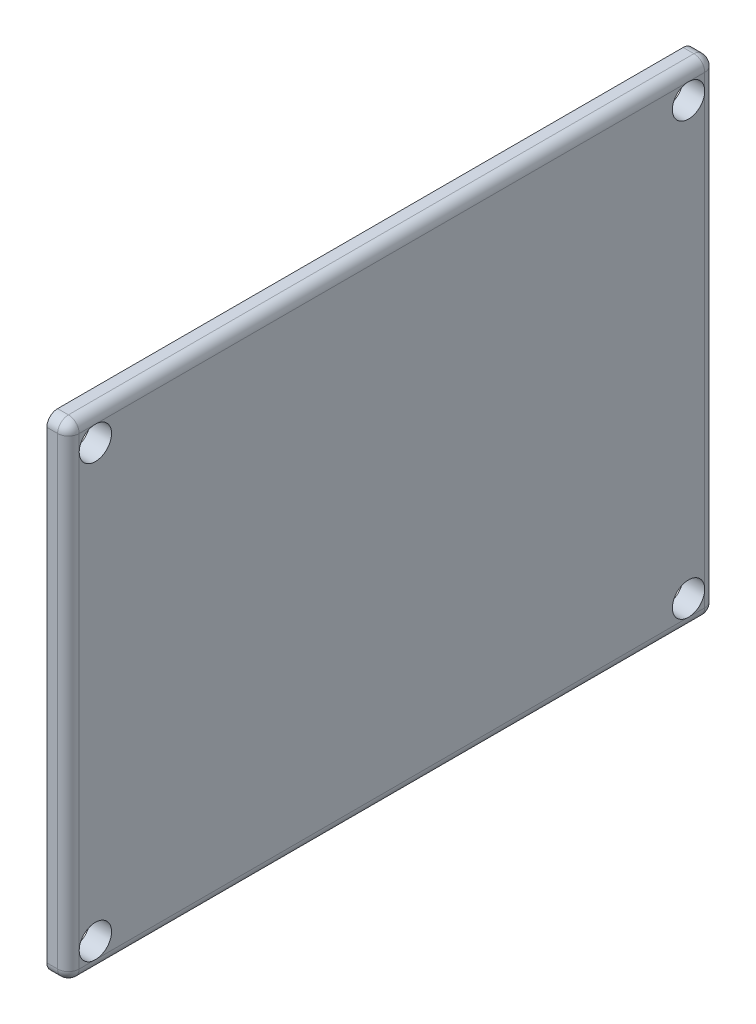
ISO-10303-21;
HEADER;
FILE_DESCRIPTION(('STEP AP214'),'2;1');
FILE_NAME('part.step','',(''),(''),'','','');
FILE_SCHEMA(('AUTOMOTIVE_DESIGN { 1 0 10303 214 1 1 1 1 }'));
ENDSEC;
DATA;
#1=APPLICATION_CONTEXT('core data for automotive mechanical design processes');
#2=APPLICATION_PROTOCOL_DEFINITION('international standard','automotive_design',2000,#1);
#3=PRODUCT_CONTEXT('',#1,'mechanical');
#4=PRODUCT('Part','Part','',(#3));
#5=PRODUCT_RELATED_PRODUCT_CATEGORY('part','',(#4));
#6=PRODUCT_DEFINITION_FORMATION('','',#4);
#7=PRODUCT_DEFINITION_CONTEXT('part definition',#1,'design');
#8=PRODUCT_DEFINITION('design','',#6,#7);
#9=PRODUCT_DEFINITION_SHAPE('','',#8);
#10=(LENGTH_UNIT() NAMED_UNIT(*) SI_UNIT(.MILLI.,.METRE.));
#11=(NAMED_UNIT(*) PLANE_ANGLE_UNIT() SI_UNIT($,.RADIAN.));
#12=(NAMED_UNIT(*) SI_UNIT($,.STERADIAN.) SOLID_ANGLE_UNIT());
#13=UNCERTAINTY_MEASURE_WITH_UNIT(LENGTH_MEASURE(1.E-05),#10,'distance_accuracy_value','');
#14=(GEOMETRIC_REPRESENTATION_CONTEXT(3) GLOBAL_UNCERTAINTY_ASSIGNED_CONTEXT((#13)) GLOBAL_UNIT_ASSIGNED_CONTEXT((#10,
#11,#12)) REPRESENTATION_CONTEXT('',''));
#15=CARTESIAN_POINT('',(0.,0.,0.));
#16=DIRECTION('',(0.,0.,1.));
#17=DIRECTION('',(1.,0.,0.));
#18=AXIS2_PLACEMENT_3D('',#15,#16,#17);
#19=CARTESIAN_POINT('',(2.,0.,0.));
#20=DIRECTION('',(-1.,0.,0.));
#21=DIRECTION('',(0.,0.,1.));
#22=AXIS2_PLACEMENT_3D('',#19,#20,#21);
#23=PLANE('',#22);
#24=CARTESIAN_POINT('',(2.,-20.,27.5));
#25=DIRECTION('',(1.,0.,0.));
#26=DIRECTION('',(0.,0.,-1.));
#27=AXIS2_PLACEMENT_3D('',#24,#25,#26);
#28=CIRCLE('',#27,1.49999999999999);
#29=CARTESIAN_POINT('',(2.,-21.5,27.5));
#30=VERTEX_POINT('',#29);
#31=CARTESIAN_POINT('',(2.,-20.,29.));
#32=VERTEX_POINT('',#31);
#33=EDGE_CURVE('E342',#30,#32,#28,.T.);
#34=ORIENTED_EDGE('',*,*,#33,.F.);
#35=DIRECTION('',(0.,0.,-1.));
#36=VECTOR('',#35,1.);
#37=CARTESIAN_POINT('',(2.,-21.5,0.));
#38=LINE('',#37,#36);
#39=CARTESIAN_POINT('',(2.,-21.5,-27.5));
#40=VERTEX_POINT('',#39);
#41=EDGE_CURVE('E274',#30,#40,#38,.T.);
#42=ORIENTED_EDGE('',*,*,#41,.T.);
#43=CARTESIAN_POINT('',(2.,-20.,-27.5));
#44=DIRECTION('',(1.,0.,0.));
#45=DIRECTION('',(0.,0.,-1.));
#46=AXIS2_PLACEMENT_3D('',#43,#44,#45);
#47=CIRCLE('',#46,1.49999999999999);
#48=CARTESIAN_POINT('',(2.,-20.,-29.));
#49=VERTEX_POINT('',#48);
#50=EDGE_CURVE('E335',#49,#40,#47,.T.);
#51=ORIENTED_EDGE('',*,*,#50,.F.);
#52=DIRECTION('',(0.,1.,0.));
#53=VECTOR('',#52,1.);
#54=CARTESIAN_POINT('',(2.,0.,-29.));
#55=LINE('',#54,#53);
#56=CARTESIAN_POINT('',(2.,20.,-29.));
#57=VERTEX_POINT('',#56);
#58=EDGE_CURVE('E266',#49,#57,#55,.T.);
#59=ORIENTED_EDGE('',*,*,#58,.T.);
#60=CARTESIAN_POINT('',(2.,20.,-27.5));
#61=DIRECTION('',(1.,0.,0.));
#62=DIRECTION('',(0.,0.,-1.));
#63=AXIS2_PLACEMENT_3D('',#60,#61,#62);
#64=CIRCLE('',#63,1.49999999999999);
#65=CARTESIAN_POINT('',(2.,21.5,-27.5));
#66=VERTEX_POINT('',#65);
#67=EDGE_CURVE('E202',#66,#57,#64,.T.);
#68=ORIENTED_EDGE('',*,*,#67,.F.);
#69=DIRECTION('',(0.,0.,1.));
#70=VECTOR('',#69,1.);
#71=CARTESIAN_POINT('',(2.,21.5,0.));
#72=LINE('',#71,#70);
#73=CARTESIAN_POINT('',(2.,21.5,27.5));
#74=VERTEX_POINT('',#73);
#75=EDGE_CURVE('E255',#66,#74,#72,.T.);
#76=ORIENTED_EDGE('',*,*,#75,.T.);
#77=CARTESIAN_POINT('',(2.,20.,27.5));
#78=DIRECTION('',(1.,0.,0.));
#79=DIRECTION('',(0.,0.,-1.));
#80=AXIS2_PLACEMENT_3D('',#77,#78,#79);
#81=CIRCLE('',#80,1.49999999999999);
#82=CARTESIAN_POINT('',(2.,20.,29.));
#83=VERTEX_POINT('',#82);
#84=EDGE_CURVE('E314',#83,#74,#81,.T.);
#85=ORIENTED_EDGE('',*,*,#84,.F.);
#86=DIRECTION('',(0.,-1.,0.));
#87=VECTOR('',#86,1.);
#88=CARTESIAN_POINT('',(2.,0.,29.));
#89=LINE('',#88,#87);
#90=EDGE_CURVE('E246',#83,#32,#89,.T.);
#91=ORIENTED_EDGE('',*,*,#90,.T.);
#92=EDGE_LOOP('',(#34,#42,#51,#59,#68,#76,#85,#91));
#93=FACE_BOUND('',#92,.T.);
#94=ADVANCED_FACE('F41',(#93),#23,.F.);
#95=EDGE_CURVE('E334',#40,#49,#47,.T.);
#96=ORIENTED_EDGE('',*,*,#95,.F.);
#97=DIRECTION('',(0.,0.,-1.));
#98=VECTOR('',#97,1.);
#99=CARTESIAN_POINT('',(2.,-21.5,0.));
#100=LINE('',#99,#98);
#101=CARTESIAN_POINT('',(2.,-21.5,-29.));
#102=VERTEX_POINT('',#101);
#103=EDGE_CURVE('E59',#40,#102,#100,.T.);
#104=ORIENTED_EDGE('',*,*,#103,.T.);
#105=DIRECTION('',(0.,1.,0.));
#106=VECTOR('',#105,1.);
#107=CARTESIAN_POINT('',(2.,0.,-29.));
#108=LINE('',#107,#106);
#109=EDGE_CURVE('E269',#102,#49,#108,.T.);
#110=ORIENTED_EDGE('',*,*,#109,.T.);
#111=EDGE_LOOP('',(#96,#104,#110));
#112=FACE_BOUND('',#111,.T.);
#113=ADVANCED_FACE('F371',(#112),#23,.F.);
#114=EDGE_CURVE('E326',#57,#66,#64,.T.);
#115=ORIENTED_EDGE('',*,*,#114,.F.);
#116=DIRECTION('',(0.,1.,0.));
#117=VECTOR('',#116,1.);
#118=CARTESIAN_POINT('',(2.,0.,-29.));
#119=LINE('',#118,#117);
#120=CARTESIAN_POINT('',(2.,21.5,-29.));
#121=VERTEX_POINT('',#120);
#122=EDGE_CURVE('E67',#57,#121,#119,.T.);
#123=ORIENTED_EDGE('',*,*,#122,.T.);
#124=DIRECTION('',(0.,0.,1.));
#125=VECTOR('',#124,1.);
#126=CARTESIAN_POINT('',(2.,21.5,0.));
#127=LINE('',#126,#125);
#128=EDGE_CURVE('E258',#121,#66,#127,.T.);
#129=ORIENTED_EDGE('',*,*,#128,.T.);
#130=EDGE_LOOP('',(#115,#123,#129));
#131=FACE_BOUND('',#130,.T.);
#132=ADVANCED_FACE('F394',(#131),#23,.F.);
#133=DIRECTION('',(0.,-1.,0.));
#134=VECTOR('',#133,1.);
#135=CARTESIAN_POINT('',(2.,0.,29.));
#136=LINE('',#135,#134);
#137=CARTESIAN_POINT('',(2.,-21.5,29.));
#138=VERTEX_POINT('',#137);
#139=EDGE_CURVE('E243',#32,#138,#136,.T.);
#140=ORIENTED_EDGE('',*,*,#139,.T.);
#141=DIRECTION('',(0.,0.,-1.));
#142=VECTOR('',#141,1.);
#143=CARTESIAN_POINT('',(2.,-21.5,0.));
#144=LINE('',#143,#142);
#145=EDGE_CURVE('E261',#138,#30,#144,.T.);
#146=ORIENTED_EDGE('',*,*,#145,.T.);
#147=EDGE_CURVE('E188',#32,#30,#28,.T.);
#148=ORIENTED_EDGE('',*,*,#147,.F.);
#149=EDGE_LOOP('',(#140,#146,#148));
#150=FACE_BOUND('',#149,.T.);
#151=ADVANCED_FACE('F355',(#150),#23,.F.);
#152=CARTESIAN_POINT('',(2.,-22.5,-30.));
#153=DIRECTION('',(0.,0.,1.));
#154=DIRECTION('',(1.,0.,0.));
#155=AXIS2_PLACEMENT_3D('',#152,#153,#154);
#156=PLANE('',#155);
#157=DIRECTION('',(-1.,0.,0.));
#158=VECTOR('',#157,1.);
#159=CARTESIAN_POINT('',(2.,21.5,-30.));
#160=LINE('',#159,#158);
#161=CARTESIAN_POINT('',(0.,21.5,-30.));
#162=VERTEX_POINT('',#161);
#163=CARTESIAN_POINT('',(1.,21.5,-30.));
#164=VERTEX_POINT('',#163);
#165=EDGE_CURVE('E160',#162,#164,#160,.F.);
#166=ORIENTED_EDGE('',*,*,#165,.T.);
#167=DIRECTION('',(0.,1.,0.));
#168=VECTOR('',#167,1.);
#169=CARTESIAN_POINT('',(1.,-22.5,-30.));
#170=LINE('',#169,#168);
#171=CARTESIAN_POINT('',(1.,-21.5,-30.));
#172=VERTEX_POINT('',#171);
#173=EDGE_CURVE('E155',#164,#172,#170,.F.);
#174=ORIENTED_EDGE('',*,*,#173,.T.);
#175=DIRECTION('',(-1.,0.,0.));
#176=VECTOR('',#175,1.);
#177=CARTESIAN_POINT('',(2.,-21.5,-30.));
#178=LINE('',#177,#176);
#179=CARTESIAN_POINT('',(0.,-21.5,-30.));
#180=VERTEX_POINT('',#179);
#181=EDGE_CURVE('E147',#172,#180,#178,.T.);
#182=ORIENTED_EDGE('',*,*,#181,.T.);
#183=DIRECTION('',(0.,1.,0.));
#184=VECTOR('',#183,1.);
#185=CARTESIAN_POINT('',(0.,-22.5,-30.));
#186=LINE('',#185,#184);
#187=EDGE_CURVE('E152',#180,#162,#186,.T.);
#188=ORIENTED_EDGE('',*,*,#187,.T.);
#189=EDGE_LOOP('',(#166,#174,#182,#188));
#190=FACE_BOUND('',#189,.T.);
#191=ADVANCED_FACE('F150',(#190),#156,.F.);
#192=CARTESIAN_POINT('',(2.,22.5,30.));
#193=DIRECTION('',(0.,-1.,0.));
#194=DIRECTION('',(0.,0.,-1.));
#195=AXIS2_PLACEMENT_3D('',#192,#193,#194);
#196=PLANE('',#195);
#197=DIRECTION('',(-1.,0.,0.));
#198=VECTOR('',#197,1.);
#199=CARTESIAN_POINT('',(2.,22.5,29.));
#200=LINE('',#199,#198);
#201=CARTESIAN_POINT('',(0.,22.5,29.));
#202=VERTEX_POINT('',#201);
#203=CARTESIAN_POINT('',(1.,22.5,29.));
#204=VERTEX_POINT('',#203);
#205=EDGE_CURVE('E223',#202,#204,#200,.F.);
#206=ORIENTED_EDGE('',*,*,#205,.T.);
#207=DIRECTION('',(0.,0.,1.));
#208=VECTOR('',#207,1.);
#209=CARTESIAN_POINT('',(1.,22.5,30.));
#210=LINE('',#209,#208);
#211=CARTESIAN_POINT('',(1.,22.5,-29.));
#212=VERTEX_POINT('',#211);
#213=EDGE_CURVE('E51',#204,#212,#210,.F.);
#214=ORIENTED_EDGE('',*,*,#213,.T.);
#215=DIRECTION('',(-1.,0.,0.));
#216=VECTOR('',#215,1.);
#217=CARTESIAN_POINT('',(2.,22.5,-29.));
#218=LINE('',#217,#216);
#219=CARTESIAN_POINT('',(0.,22.5,-29.));
#220=VERTEX_POINT('',#219);
#221=EDGE_CURVE('E227',#212,#220,#218,.T.);
#222=ORIENTED_EDGE('',*,*,#221,.T.);
#223=DIRECTION('',(0.,0.,1.));
#224=VECTOR('',#223,1.);
#225=CARTESIAN_POINT('',(0.,22.5,30.));
#226=LINE('',#225,#224);
#227=EDGE_CURVE('E179',#220,#202,#226,.T.);
#228=ORIENTED_EDGE('',*,*,#227,.T.);
#229=EDGE_LOOP('',(#206,#214,#222,#228));
#230=FACE_BOUND('',#229,.T.);
#231=ADVANCED_FACE('F412',(#230),#196,.F.);
#232=CARTESIAN_POINT('',(2.,-22.5,30.));
#233=DIRECTION('',(0.,0.,-1.));
#234=DIRECTION('',(-1.,0.,0.));
#235=AXIS2_PLACEMENT_3D('',#232,#233,#234);
#236=PLANE('',#235);
#237=DIRECTION('',(-1.,0.,0.));
#238=VECTOR('',#237,1.);
#239=CARTESIAN_POINT('',(2.,-21.5,30.));
#240=LINE('',#239,#238);
#241=CARTESIAN_POINT('',(0.,-21.5,30.));
#242=VERTEX_POINT('',#241);
#243=CARTESIAN_POINT('',(1.,-21.5,30.));
#244=VERTEX_POINT('',#243);
#245=EDGE_CURVE('E219',#242,#244,#240,.F.);
#246=ORIENTED_EDGE('',*,*,#245,.T.);
#247=DIRECTION('',(0.,-1.,0.));
#248=VECTOR('',#247,1.);
#249=CARTESIAN_POINT('',(1.,-22.5,30.));
#250=LINE('',#249,#248);
#251=CARTESIAN_POINT('',(1.,21.5,30.));
#252=VERTEX_POINT('',#251);
#253=EDGE_CURVE('E11',#244,#252,#250,.F.);
#254=ORIENTED_EDGE('',*,*,#253,.T.);
#255=DIRECTION('',(-1.,0.,0.));
#256=VECTOR('',#255,1.);
#257=CARTESIAN_POINT('',(2.,21.5,30.));
#258=LINE('',#257,#256);
#259=CARTESIAN_POINT('',(0.,21.5,30.));
#260=VERTEX_POINT('',#259);
#261=EDGE_CURVE('E216',#252,#260,#258,.T.);
#262=ORIENTED_EDGE('',*,*,#261,.T.);
#263=DIRECTION('',(0.,-1.,0.));
#264=VECTOR('',#263,1.);
#265=CARTESIAN_POINT('',(0.,-22.5,30.));
#266=LINE('',#265,#264);
#267=EDGE_CURVE('E185',#260,#242,#266,.T.);
#268=ORIENTED_EDGE('',*,*,#267,.T.);
#269=EDGE_LOOP('',(#246,#254,#262,#268));
#270=FACE_BOUND('',#269,.T.);
#271=ADVANCED_FACE('F404',(#270),#236,.F.);
#272=CARTESIAN_POINT('',(2.,-22.5,30.));
#273=DIRECTION('',(0.,1.,0.));
#274=DIRECTION('',(0.,0.,1.));
#275=AXIS2_PLACEMENT_3D('',#272,#273,#274);
#276=PLANE('',#275);
#277=DIRECTION('',(-1.,0.,0.));
#278=VECTOR('',#277,1.);
#279=CARTESIAN_POINT('',(2.,-22.5,-29.));
#280=LINE('',#279,#278);
#281=CARTESIAN_POINT('',(0.,-22.5,-29.));
#282=VERTEX_POINT('',#281);
#283=CARTESIAN_POINT('',(1.,-22.5,-29.));
#284=VERTEX_POINT('',#283);
#285=EDGE_CURVE('E166',#282,#284,#280,.F.);
#286=ORIENTED_EDGE('',*,*,#285,.T.);
#287=DIRECTION('',(0.,0.,-1.));
#288=VECTOR('',#287,1.);
#289=CARTESIAN_POINT('',(1.,-22.5,30.));
#290=LINE('',#289,#288);
#291=CARTESIAN_POINT('',(1.,-22.5,29.));
#292=VERTEX_POINT('',#291);
#293=EDGE_CURVE('E279',#284,#292,#290,.F.);
#294=ORIENTED_EDGE('',*,*,#293,.T.);
#295=DIRECTION('',(-1.,0.,0.));
#296=VECTOR('',#295,1.);
#297=CARTESIAN_POINT('',(2.,-22.5,29.));
#298=LINE('',#297,#296);
#299=CARTESIAN_POINT('',(0.,-22.5,29.));
#300=VERTEX_POINT('',#299);
#301=EDGE_CURVE('E171',#292,#300,#298,.T.);
#302=ORIENTED_EDGE('',*,*,#301,.T.);
#303=DIRECTION('',(0.,0.,-1.));
#304=VECTOR('',#303,1.);
#305=CARTESIAN_POINT('',(0.,-22.5,30.));
#306=LINE('',#305,#304);
#307=EDGE_CURVE('E195',#300,#282,#306,.T.);
#308=ORIENTED_EDGE('',*,*,#307,.T.);
#309=EDGE_LOOP('',(#286,#294,#302,#308));
#310=FACE_BOUND('',#309,.T.);
#311=ADVANCED_FACE('F397',(#310),#276,.F.);
#312=EDGE_CURVE('E203',#74,#83,#81,.T.);
#313=ORIENTED_EDGE('',*,*,#312,.F.);
#314=DIRECTION('',(0.,0.,1.));
#315=VECTOR('',#314,1.);
#316=CARTESIAN_POINT('',(2.,21.5,0.));
#317=LINE('',#316,#315);
#318=CARTESIAN_POINT('',(2.,21.5,29.));
#319=VERTEX_POINT('',#318);
#320=EDGE_CURVE('E252',#74,#319,#317,.T.);
#321=ORIENTED_EDGE('',*,*,#320,.T.);
#322=DIRECTION('',(0.,-1.,0.));
#323=VECTOR('',#322,1.);
#324=CARTESIAN_POINT('',(2.,0.,29.));
#325=LINE('',#324,#323);
#326=EDGE_CURVE('E249',#319,#83,#325,.T.);
#327=ORIENTED_EDGE('',*,*,#326,.T.);
#328=EDGE_LOOP('',(#313,#321,#327));
#329=FACE_BOUND('',#328,.T.);
#330=ADVANCED_FACE('F390',(#329),#23,.F.);
#331=CARTESIAN_POINT('',(0.,0.,0.));
#332=DIRECTION('',(-1.,0.,0.));
#333=DIRECTION('',(0.,0.,1.));
#334=AXIS2_PLACEMENT_3D('',#331,#332,#333);
#335=PLANE('',#334);
#336=CARTESIAN_POINT('',(0.,20.,27.5));
#337=DIRECTION('',(-1.,0.,0.));
#338=DIRECTION('',(0.,0.,1.));
#339=AXIS2_PLACEMENT_3D('',#336,#337,#338);
#340=CIRCLE('',#339,1.49999999999999);
#341=CARTESIAN_POINT('',(0.,20.,29.));
#342=VERTEX_POINT('',#341);
#343=EDGE_CURVE('E198',#342,#342,#340,.T.);
#344=ORIENTED_EDGE('',*,*,#343,.F.);
#345=EDGE_LOOP('',(#344));
#346=FACE_BOUND('',#345,.T.);
#347=CARTESIAN_POINT('',(0.,20.,-27.5));
#348=DIRECTION('',(-1.,0.,0.));
#349=DIRECTION('',(0.,0.,1.));
#350=AXIS2_PLACEMENT_3D('',#347,#348,#349);
#351=CIRCLE('',#350,1.49999999999999);
#352=CARTESIAN_POINT('',(0.,20.,-26.));
#353=VERTEX_POINT('',#352);
#354=EDGE_CURVE('E330',#353,#353,#351,.T.);
#355=ORIENTED_EDGE('',*,*,#354,.F.);
#356=EDGE_LOOP('',(#355));
#357=FACE_BOUND('',#356,.T.);
#358=CARTESIAN_POINT('',(0.,-20.,-27.5));
#359=DIRECTION('',(-1.,0.,0.));
#360=DIRECTION('',(0.,0.,1.));
#361=AXIS2_PLACEMENT_3D('',#358,#359,#360);
#362=CIRCLE('',#361,1.49999999999999);
#363=CARTESIAN_POINT('',(0.,-20.,-26.));
#364=VERTEX_POINT('',#363);
#365=EDGE_CURVE('E339',#364,#364,#362,.T.);
#366=ORIENTED_EDGE('',*,*,#365,.F.);
#367=EDGE_LOOP('',(#366));
#368=FACE_BOUND('',#367,.T.);
#369=CARTESIAN_POINT('',(0.,-20.,27.5));
#370=DIRECTION('',(-1.,0.,0.));
#371=DIRECTION('',(0.,0.,1.));
#372=AXIS2_PLACEMENT_3D('',#369,#370,#371);
#373=CIRCLE('',#372,1.49999999999999);
#374=CARTESIAN_POINT('',(0.,-20.,29.));
#375=VERTEX_POINT('',#374);
#376=EDGE_CURVE('E180',#375,#375,#373,.T.);
#377=ORIENTED_EDGE('',*,*,#376,.F.);
#378=EDGE_LOOP('',(#377));
#379=FACE_BOUND('',#378,.T.);
#380=ORIENTED_EDGE('',*,*,#187,.F.);
#381=CARTESIAN_POINT('',(0.,-21.5,-29.));
#382=DIRECTION('',(-1.,0.,0.));
#383=DIRECTION('',(0.,0.,1.));
#384=AXIS2_PLACEMENT_3D('',#381,#382,#383);
#385=CIRCLE('',#384,1.);
#386=EDGE_CURVE('E163',#180,#282,#385,.T.);
#387=ORIENTED_EDGE('',*,*,#386,.T.);
#388=ORIENTED_EDGE('',*,*,#307,.F.);
#389=CARTESIAN_POINT('',(0.,-21.5,29.));
#390=DIRECTION('',(-1.,0.,0.));
#391=DIRECTION('',(0.,0.,1.));
#392=AXIS2_PLACEMENT_3D('',#389,#390,#391);
#393=CIRCLE('',#392,1.);
#394=EDGE_CURVE('E172',#300,#242,#393,.T.);
#395=ORIENTED_EDGE('',*,*,#394,.T.);
#396=ORIENTED_EDGE('',*,*,#267,.F.);
#397=CARTESIAN_POINT('',(0.,21.5,29.));
#398=DIRECTION('',(-1.,0.,0.));
#399=DIRECTION('',(0.,0.,1.));
#400=AXIS2_PLACEMENT_3D('',#397,#398,#399);
#401=CIRCLE('',#400,1.);
#402=EDGE_CURVE('E159',#260,#202,#401,.T.);
#403=ORIENTED_EDGE('',*,*,#402,.T.);
#404=ORIENTED_EDGE('',*,*,#227,.F.);
#405=CARTESIAN_POINT('',(0.,21.5,-29.));
#406=DIRECTION('',(-1.,0.,0.));
#407=DIRECTION('',(0.,0.,1.));
#408=AXIS2_PLACEMENT_3D('',#405,#406,#407);
#409=CIRCLE('',#408,1.);
#410=EDGE_CURVE('E177',#220,#162,#409,.T.);
#411=ORIENTED_EDGE('',*,*,#410,.T.);
#412=EDGE_LOOP('',(#380,#387,#388,#395,#396,#403,#404,#411));
#413=FACE_BOUND('',#412,.T.);
#414=ADVANCED_FACE('F174',(#346,#357,#368,#379,#413),#335,.T.);
#415=CARTESIAN_POINT('',(2.,-20.,27.5));
#416=DIRECTION('',(1.,0.,0.));
#417=DIRECTION('',(0.,0.,-1.));
#418=AXIS2_PLACEMENT_3D('',#415,#416,#417);
#419=CYLINDRICAL_SURFACE('',#418,1.49999999999999);
#420=ORIENTED_EDGE('',*,*,#376,.T.);
#421=EDGE_LOOP('',(#420));
#422=FACE_BOUND('',#421,.T.);
#423=ORIENTED_EDGE('',*,*,#147,.T.);
#424=ORIENTED_EDGE('',*,*,#33,.T.);
#425=EDGE_LOOP('',(#423,#424));
#426=FACE_BOUND('',#425,.T.);
#427=ADVANCED_FACE('F351',(#422,#426),#419,.F.);
#428=CARTESIAN_POINT('',(2.,-20.,-27.5));
#429=DIRECTION('',(1.,0.,0.));
#430=DIRECTION('',(0.,0.,-1.));
#431=AXIS2_PLACEMENT_3D('',#428,#429,#430);
#432=CYLINDRICAL_SURFACE('',#431,1.49999999999999);
#433=ORIENTED_EDGE('',*,*,#365,.T.);
#434=EDGE_LOOP('',(#433));
#435=FACE_BOUND('',#434,.T.);
#436=ORIENTED_EDGE('',*,*,#50,.T.);
#437=ORIENTED_EDGE('',*,*,#95,.T.);
#438=EDGE_LOOP('',(#436,#437));
#439=FACE_BOUND('',#438,.T.);
#440=ADVANCED_FACE('F374',(#435,#439),#432,.F.);
#441=CARTESIAN_POINT('',(2.,20.,-27.5));
#442=DIRECTION('',(1.,0.,0.));
#443=DIRECTION('',(0.,0.,-1.));
#444=AXIS2_PLACEMENT_3D('',#441,#442,#443);
#445=CYLINDRICAL_SURFACE('',#444,1.49999999999999);
#446=ORIENTED_EDGE('',*,*,#354,.T.);
#447=EDGE_LOOP('',(#446));
#448=FACE_BOUND('',#447,.T.);
#449=ORIENTED_EDGE('',*,*,#114,.T.);
#450=ORIENTED_EDGE('',*,*,#67,.T.);
#451=EDGE_LOOP('',(#449,#450));
#452=FACE_BOUND('',#451,.T.);
#453=ADVANCED_FACE('F376',(#448,#452),#445,.F.);
#454=CARTESIAN_POINT('',(2.,20.,27.5));
#455=DIRECTION('',(1.,0.,0.));
#456=DIRECTION('',(0.,0.,-1.));
#457=AXIS2_PLACEMENT_3D('',#454,#455,#456);
#458=CYLINDRICAL_SURFACE('',#457,1.49999999999999);
#459=ORIENTED_EDGE('',*,*,#343,.T.);
#460=EDGE_LOOP('',(#459));
#461=FACE_BOUND('',#460,.T.);
#462=ORIENTED_EDGE('',*,*,#312,.T.);
#463=ORIENTED_EDGE('',*,*,#84,.T.);
#464=EDGE_LOOP('',(#462,#463));
#465=FACE_BOUND('',#464,.T.);
#466=ADVANCED_FACE('F383',(#461,#465),#458,.F.);
#467=CARTESIAN_POINT('',(2.,-21.5,-29.));
#468=DIRECTION('',(-1.,0.,0.));
#469=DIRECTION('',(0.,0.,1.));
#470=AXIS2_PLACEMENT_3D('',#467,#468,#469);
#471=CYLINDRICAL_SURFACE('',#470,1.);
#472=ORIENTED_EDGE('',*,*,#181,.F.);
#473=CARTESIAN_POINT('',(1.,-21.5,-29.));
#474=DIRECTION('',(-1.,0.,0.));
#475=DIRECTION('',(0.,0.,1.));
#476=AXIS2_PLACEMENT_3D('',#473,#474,#475);
#477=CIRCLE('',#476,1.);
#478=EDGE_CURVE('E237',#172,#284,#477,.T.);
#479=ORIENTED_EDGE('',*,*,#478,.T.);
#480=ORIENTED_EDGE('',*,*,#285,.F.);
#481=ORIENTED_EDGE('',*,*,#386,.F.);
#482=EDGE_LOOP('',(#472,#479,#480,#481));
#483=FACE_BOUND('',#482,.T.);
#484=ADVANCED_FACE('F164',(#483),#471,.T.);
#485=CARTESIAN_POINT('',(2.,-21.5,29.));
#486=DIRECTION('',(-1.,0.,0.));
#487=DIRECTION('',(0.,0.,1.));
#488=AXIS2_PLACEMENT_3D('',#485,#486,#487);
#489=CYLINDRICAL_SURFACE('',#488,1.);
#490=ORIENTED_EDGE('',*,*,#301,.F.);
#491=CARTESIAN_POINT('',(1.,-21.5,29.));
#492=DIRECTION('',(-1.,0.,0.));
#493=DIRECTION('',(0.,0.,1.));
#494=AXIS2_PLACEMENT_3D('',#491,#492,#493);
#495=CIRCLE('',#494,1.);
#496=EDGE_CURVE('E240',#292,#244,#495,.T.);
#497=ORIENTED_EDGE('',*,*,#496,.T.);
#498=ORIENTED_EDGE('',*,*,#245,.F.);
#499=ORIENTED_EDGE('',*,*,#394,.F.);
#500=EDGE_LOOP('',(#490,#497,#498,#499));
#501=FACE_BOUND('',#500,.T.);
#502=ADVANCED_FACE('F448',(#501),#489,.T.);
#503=CARTESIAN_POINT('',(2.,21.5,-29.));
#504=DIRECTION('',(-1.,0.,0.));
#505=DIRECTION('',(0.,0.,1.));
#506=AXIS2_PLACEMENT_3D('',#503,#504,#505);
#507=CYLINDRICAL_SURFACE('',#506,1.);
#508=ORIENTED_EDGE('',*,*,#221,.F.);
#509=CARTESIAN_POINT('',(1.,21.5,-29.));
#510=DIRECTION('',(-1.,0.,0.));
#511=DIRECTION('',(0.,0.,1.));
#512=AXIS2_PLACEMENT_3D('',#509,#510,#511);
#513=CIRCLE('',#512,1.);
#514=EDGE_CURVE('E234',#212,#164,#513,.T.);
#515=ORIENTED_EDGE('',*,*,#514,.T.);
#516=ORIENTED_EDGE('',*,*,#165,.F.);
#517=ORIENTED_EDGE('',*,*,#410,.F.);
#518=EDGE_LOOP('',(#508,#515,#516,#517));
#519=FACE_BOUND('',#518,.T.);
#520=ADVANCED_FACE('F455',(#519),#507,.T.);
#521=CARTESIAN_POINT('',(2.,21.5,29.));
#522=DIRECTION('',(-1.,0.,0.));
#523=DIRECTION('',(0.,0.,1.));
#524=AXIS2_PLACEMENT_3D('',#521,#522,#523);
#525=CYLINDRICAL_SURFACE('',#524,1.);
#526=ORIENTED_EDGE('',*,*,#261,.F.);
#527=CARTESIAN_POINT('',(1.,21.5,29.));
#528=DIRECTION('',(-1.,0.,0.));
#529=DIRECTION('',(0.,0.,1.));
#530=AXIS2_PLACEMENT_3D('',#527,#528,#529);
#531=CIRCLE('',#530,1.);
#532=EDGE_CURVE('E230',#252,#204,#531,.T.);
#533=ORIENTED_EDGE('',*,*,#532,.T.);
#534=ORIENTED_EDGE('',*,*,#205,.F.);
#535=ORIENTED_EDGE('',*,*,#402,.F.);
#536=EDGE_LOOP('',(#526,#533,#534,#535));
#537=FACE_BOUND('',#536,.T.);
#538=ADVANCED_FACE('F438',(#537),#525,.T.);
#539=CARTESIAN_POINT('',(1.,-21.5,-29.));
#540=DIRECTION('',(-1.,0.,0.));
#541=DIRECTION('',(0.,0.,1.));
#542=AXIS2_PLACEMENT_3D('',#539,#540,#541);
#543=SPHERICAL_SURFACE('',#542,1.);
#544=CARTESIAN_POINT('',(1.,-21.5,-29.));
#545=DIRECTION('',(0.,0.,1.));
#546=DIRECTION('',(1.,0.,0.));
#547=AXIS2_PLACEMENT_3D('',#544,#545,#546);
#548=CIRCLE('',#547,1.);
#549=EDGE_CURVE('E306',#284,#102,#548,.T.);
#550=ORIENTED_EDGE('',*,*,#549,.F.);
#551=ORIENTED_EDGE('',*,*,#478,.F.);
#552=CARTESIAN_POINT('',(1.,-21.5,-29.));
#553=DIRECTION('',(0.,1.,0.));
#554=DIRECTION('',(0.,0.,1.));
#555=AXIS2_PLACEMENT_3D('',#552,#553,#554);
#556=CIRCLE('',#555,1.);
#557=EDGE_CURVE('E45',#102,#172,#556,.T.);
#558=ORIENTED_EDGE('',*,*,#557,.F.);
#559=EDGE_LOOP('',(#550,#551,#558));
#560=FACE_BOUND('',#559,.T.);
#561=ADVANCED_FACE('F43',(#560),#543,.T.);
#562=CARTESIAN_POINT('',(1.,0.,-29.));
#563=DIRECTION('',(0.,1.,0.));
#564=DIRECTION('',(0.,0.,1.));
#565=AXIS2_PLACEMENT_3D('',#562,#563,#564);
#566=CYLINDRICAL_SURFACE('',#565,1.);
#567=ORIENTED_EDGE('',*,*,#557,.T.);
#568=ORIENTED_EDGE('',*,*,#173,.F.);
#569=CARTESIAN_POINT('',(1.,21.5,-29.));
#570=DIRECTION('',(0.,1.,0.));
#571=DIRECTION('',(0.,0.,1.));
#572=AXIS2_PLACEMENT_3D('',#569,#570,#571);
#573=CIRCLE('',#572,1.);
#574=EDGE_CURVE('E303',#121,#164,#573,.T.);
#575=ORIENTED_EDGE('',*,*,#574,.F.);
#576=ORIENTED_EDGE('',*,*,#122,.F.);
#577=ORIENTED_EDGE('',*,*,#58,.F.);
#578=ORIENTED_EDGE('',*,*,#109,.F.);
#579=EDGE_LOOP('',(#567,#568,#575,#576,#577,#578));
#580=FACE_BOUND('',#579,.T.);
#581=ADVANCED_FACE('F421',(#580),#566,.T.);
#582=CARTESIAN_POINT('',(1.,-21.5,0.));
#583=DIRECTION('',(0.,0.,-1.));
#584=DIRECTION('',(-1.,0.,0.));
#585=AXIS2_PLACEMENT_3D('',#582,#583,#584);
#586=CYLINDRICAL_SURFACE('',#585,1.);
#587=ORIENTED_EDGE('',*,*,#41,.F.);
#588=ORIENTED_EDGE('',*,*,#145,.F.);
#589=CARTESIAN_POINT('',(1.,-21.5,29.));
#590=DIRECTION('',(0.,0.,1.));
#591=DIRECTION('',(1.,0.,0.));
#592=AXIS2_PLACEMENT_3D('',#589,#590,#591);
#593=CIRCLE('',#592,1.);
#594=EDGE_CURVE('E299',#292,#138,#593,.T.);
#595=ORIENTED_EDGE('',*,*,#594,.F.);
#596=ORIENTED_EDGE('',*,*,#293,.F.);
#597=ORIENTED_EDGE('',*,*,#549,.T.);
#598=ORIENTED_EDGE('',*,*,#103,.F.);
#599=EDGE_LOOP('',(#587,#588,#595,#596,#597,#598));
#600=FACE_BOUND('',#599,.T.);
#601=ADVANCED_FACE('F368',(#600),#586,.T.);
#602=CARTESIAN_POINT('',(1.,21.5,-29.));
#603=DIRECTION('',(-1.,0.,0.));
#604=DIRECTION('',(0.,0.,1.));
#605=AXIS2_PLACEMENT_3D('',#602,#603,#604);
#606=SPHERICAL_SURFACE('',#605,1.);
#607=ORIENTED_EDGE('',*,*,#574,.T.);
#608=ORIENTED_EDGE('',*,*,#514,.F.);
#609=CARTESIAN_POINT('',(1.,21.5,-29.));
#610=DIRECTION('',(0.,0.,1.));
#611=DIRECTION('',(1.,0.,0.));
#612=AXIS2_PLACEMENT_3D('',#609,#610,#611);
#613=CIRCLE('',#612,1.);
#614=EDGE_CURVE('E295',#121,#212,#613,.T.);
#615=ORIENTED_EDGE('',*,*,#614,.F.);
#616=EDGE_LOOP('',(#607,#608,#615));
#617=FACE_BOUND('',#616,.T.);
#618=ADVANCED_FACE('F425',(#617),#606,.T.);
#619=CARTESIAN_POINT('',(1.,-21.5,29.));
#620=DIRECTION('',(-1.,0.,0.));
#621=DIRECTION('',(0.,0.,1.));
#622=AXIS2_PLACEMENT_3D('',#619,#620,#621);
#623=SPHERICAL_SURFACE('',#622,1.);
#624=ORIENTED_EDGE('',*,*,#496,.F.);
#625=ORIENTED_EDGE('',*,*,#594,.T.);
#626=CARTESIAN_POINT('',(1.,-21.5,29.));
#627=DIRECTION('',(0.,1.,0.));
#628=DIRECTION('',(0.,0.,1.));
#629=AXIS2_PLACEMENT_3D('',#626,#627,#628);
#630=CIRCLE('',#629,1.);
#631=EDGE_CURVE('E291',#244,#138,#630,.T.);
#632=ORIENTED_EDGE('',*,*,#631,.F.);
#633=EDGE_LOOP('',(#624,#625,#632));
#634=FACE_BOUND('',#633,.T.);
#635=ADVANCED_FACE('F366',(#634),#623,.T.);
#636=CARTESIAN_POINT('',(1.,21.5,0.));
#637=DIRECTION('',(0.,0.,1.));
#638=DIRECTION('',(1.,0.,0.));
#639=AXIS2_PLACEMENT_3D('',#636,#637,#638);
#640=CYLINDRICAL_SURFACE('',#639,1.);
#641=ORIENTED_EDGE('',*,*,#614,.T.);
#642=ORIENTED_EDGE('',*,*,#213,.F.);
#643=CARTESIAN_POINT('',(1.,21.5,29.));
#644=DIRECTION('',(0.,0.,1.));
#645=DIRECTION('',(1.,0.,0.));
#646=AXIS2_PLACEMENT_3D('',#643,#644,#645);
#647=CIRCLE('',#646,1.);
#648=EDGE_CURVE('E288',#319,#204,#647,.T.);
#649=ORIENTED_EDGE('',*,*,#648,.F.);
#650=ORIENTED_EDGE('',*,*,#320,.F.);
#651=ORIENTED_EDGE('',*,*,#75,.F.);
#652=ORIENTED_EDGE('',*,*,#128,.F.);
#653=EDGE_LOOP('',(#641,#642,#649,#650,#651,#652));
#654=FACE_BOUND('',#653,.T.);
#655=ADVANCED_FACE('F428',(#654),#640,.T.);
#656=CARTESIAN_POINT('',(1.,0.,29.));
#657=DIRECTION('',(0.,-1.,0.));
#658=DIRECTION('',(0.,0.,-1.));
#659=AXIS2_PLACEMENT_3D('',#656,#657,#658);
#660=CYLINDRICAL_SURFACE('',#659,1.);
#661=ORIENTED_EDGE('',*,*,#90,.F.);
#662=ORIENTED_EDGE('',*,*,#326,.F.);
#663=CARTESIAN_POINT('',(1.,21.5,29.));
#664=DIRECTION('',(0.,1.,0.));
#665=DIRECTION('',(0.,0.,1.));
#666=AXIS2_PLACEMENT_3D('',#663,#664,#665);
#667=CIRCLE('',#666,1.);
#668=EDGE_CURVE('E284',#252,#319,#667,.T.);
#669=ORIENTED_EDGE('',*,*,#668,.F.);
#670=ORIENTED_EDGE('',*,*,#253,.F.);
#671=ORIENTED_EDGE('',*,*,#631,.T.);
#672=ORIENTED_EDGE('',*,*,#139,.F.);
#673=EDGE_LOOP('',(#661,#662,#669,#670,#671,#672));
#674=FACE_BOUND('',#673,.T.);
#675=ADVANCED_FACE('F359',(#674),#660,.T.);
#676=CARTESIAN_POINT('',(1.,21.5,29.));
#677=DIRECTION('',(-1.,0.,0.));
#678=DIRECTION('',(0.,0.,1.));
#679=AXIS2_PLACEMENT_3D('',#676,#677,#678);
#680=SPHERICAL_SURFACE('',#679,1.);
#681=ORIENTED_EDGE('',*,*,#648,.T.);
#682=ORIENTED_EDGE('',*,*,#532,.F.);
#683=ORIENTED_EDGE('',*,*,#668,.T.);
#684=EDGE_LOOP('',(#681,#682,#683));
#685=FACE_BOUND('',#684,.T.);
#686=ADVANCED_FACE('F434',(#685),#680,.T.);
#687=CLOSED_SHELL('',(#94,#113,#132,#151,#191,#231,#271,#311,#330,#414,#427,#440,#453,#466,#484,
#502,#520,#538,#561,#581,#601,#618,#635,#655,#675,#686));
#688=MANIFOLD_SOLID_BREP('B2',#687);
#689=ADVANCED_BREP_SHAPE_REPRESENTATION('',(#18,#688),#14);
#690=SHAPE_DEFINITION_REPRESENTATION(#9,#689);
ENDSEC;
END-ISO-10303-21;
